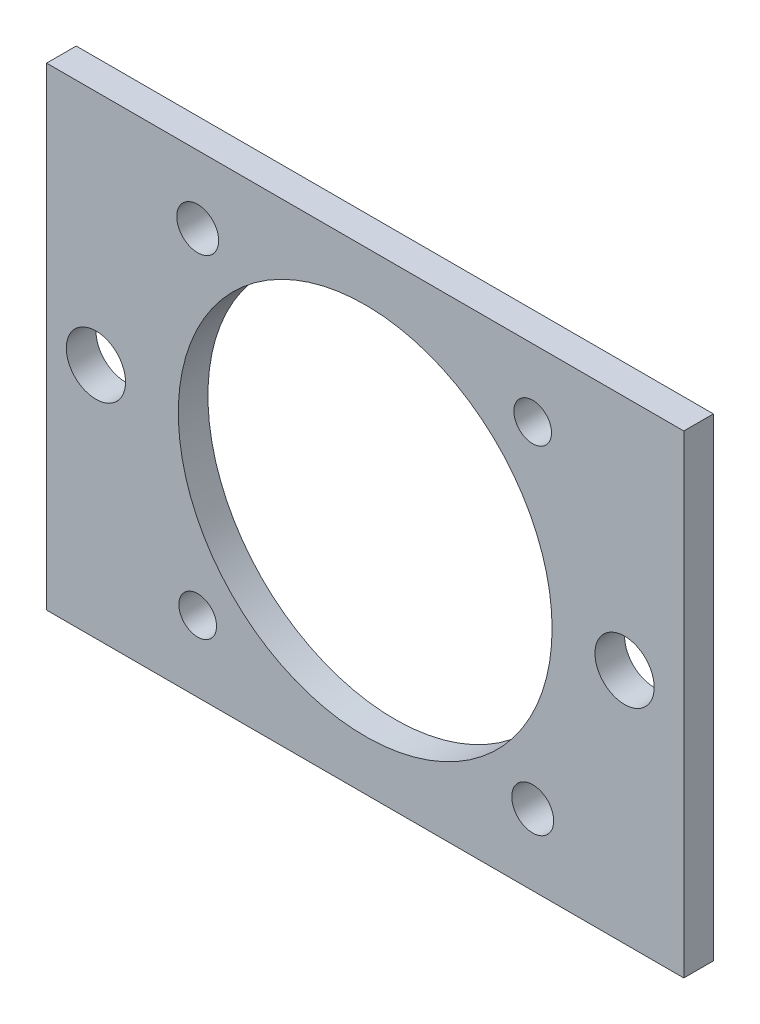
ISO-10303-21;
HEADER;
FILE_DESCRIPTION(('STEP AP214'),'2;1');
FILE_NAME('part.step','',(''),(''),'','','');
FILE_SCHEMA(('AUTOMOTIVE_DESIGN { 1 0 10303 214 1 1 1 1 }'));
ENDSEC;
DATA;
#1=APPLICATION_CONTEXT('core data for automotive mechanical design processes');
#2=APPLICATION_PROTOCOL_DEFINITION('international standard','automotive_design',2000,#1);
#3=PRODUCT_CONTEXT('',#1,'mechanical');
#4=PRODUCT('Part','Part','',(#3));
#5=PRODUCT_RELATED_PRODUCT_CATEGORY('part','',(#4));
#6=PRODUCT_DEFINITION_FORMATION('','',#4);
#7=PRODUCT_DEFINITION_CONTEXT('part definition',#1,'design');
#8=PRODUCT_DEFINITION('design','',#6,#7);
#9=PRODUCT_DEFINITION_SHAPE('','',#8);
#10=(LENGTH_UNIT() NAMED_UNIT(*) SI_UNIT(.MILLI.,.METRE.));
#11=(NAMED_UNIT(*) PLANE_ANGLE_UNIT() SI_UNIT($,.RADIAN.));
#12=(NAMED_UNIT(*) SI_UNIT($,.STERADIAN.) SOLID_ANGLE_UNIT());
#13=UNCERTAINTY_MEASURE_WITH_UNIT(LENGTH_MEASURE(1.E-05),#10,'distance_accuracy_value','');
#14=(GEOMETRIC_REPRESENTATION_CONTEXT(3) GLOBAL_UNCERTAINTY_ASSIGNED_CONTEXT((#13)) GLOBAL_UNIT_ASSIGNED_CONTEXT((#10,
#11,#12)) REPRESENTATION_CONTEXT('',''));
#15=CARTESIAN_POINT('',(0.,0.,0.));
#16=DIRECTION('',(0.,0.,1.));
#17=DIRECTION('',(1.,0.,0.));
#18=AXIS2_PLACEMENT_3D('',#15,#16,#17);
#19=CARTESIAN_POINT('',(0.,0.,3.175));
#20=DIRECTION('',(0.,0.,-1.));
#21=DIRECTION('',(-1.,0.,0.));
#22=AXIS2_PLACEMENT_3D('',#19,#20,#21);
#23=PLANE('',#22);
#24=DIRECTION('',(0.,1.,0.));
#25=VECTOR('',#24,1.);
#26=CARTESIAN_POINT('',(34.163,-25.4,3.175));
#27=LINE('',#26,#25);
#28=CARTESIAN_POINT('',(34.163,-25.4,3.175));
#29=VERTEX_POINT('',#28);
#30=CARTESIAN_POINT('',(34.163,25.4,3.175));
#31=VERTEX_POINT('',#30);
#32=EDGE_CURVE('E85',#29,#31,#27,.T.);
#33=ORIENTED_EDGE('',*,*,#32,.T.);
#34=DIRECTION('',(-1.,0.,0.));
#35=VECTOR('',#34,1.);
#36=CARTESIAN_POINT('',(-34.163,25.4,3.175));
#37=LINE('',#36,#35);
#38=CARTESIAN_POINT('',(-34.163,25.4,3.175));
#39=VERTEX_POINT('',#38);
#40=EDGE_CURVE('E80',#31,#39,#37,.T.);
#41=ORIENTED_EDGE('',*,*,#40,.T.);
#42=DIRECTION('',(0.,-1.,0.));
#43=VECTOR('',#42,1.);
#44=CARTESIAN_POINT('',(-34.163,-25.4,3.175));
#45=LINE('',#44,#43);
#46=CARTESIAN_POINT('',(-34.163,-25.4,3.175));
#47=VERTEX_POINT('',#46);
#48=EDGE_CURVE('E83',#39,#47,#45,.T.);
#49=ORIENTED_EDGE('',*,*,#48,.T.);
#50=DIRECTION('',(1.,0.,0.));
#51=VECTOR('',#50,1.);
#52=CARTESIAN_POINT('',(-34.163,-25.4,3.175));
#53=LINE('',#52,#51);
#54=EDGE_CURVE('E50',#47,#29,#53,.T.);
#55=ORIENTED_EDGE('',*,*,#54,.T.);
#56=EDGE_LOOP('',(#33,#41,#49,#55));
#57=FACE_BOUND('',#56,.T.);
#58=CARTESIAN_POINT('',(-17.9605122421383,18.1332322421383,3.175));
#59=DIRECTION('',(0.,0.,1.));
#60=DIRECTION('',(1.,0.,0.));
#61=AXIS2_PLACEMENT_3D('',#58,#59,#60);
#62=CIRCLE('',#61,2.2479);
#63=CARTESIAN_POINT('',(-15.7126122421383,18.1332322421383,3.175));
#64=VERTEX_POINT('',#63);
#65=EDGE_CURVE('E100',#64,#64,#62,.T.);
#66=ORIENTED_EDGE('',*,*,#65,.F.);
#67=EDGE_LOOP('',(#66));
#68=FACE_BOUND('',#67,.T.);
#69=CARTESIAN_POINT('',(17.9605122421383,18.1332322421383,3.175));
#70=DIRECTION('',(0.,0.,1.));
#71=DIRECTION('',(1.,0.,0.));
#72=AXIS2_PLACEMENT_3D('',#69,#70,#71);
#73=CIRCLE('',#72,2.0193);
#74=CARTESIAN_POINT('',(19.9798122421383,18.1332322421383,3.175));
#75=VERTEX_POINT('',#74);
#76=EDGE_CURVE('E115',#75,#75,#73,.T.);
#77=ORIENTED_EDGE('',*,*,#76,.F.);
#78=EDGE_LOOP('',(#77));
#79=FACE_BOUND('',#78,.T.);
#80=CARTESIAN_POINT('',(17.9605122421383,-17.7877922421383,3.175));
#81=DIRECTION('',(0.,0.,1.));
#82=DIRECTION('',(1.,0.,0.));
#83=AXIS2_PLACEMENT_3D('',#80,#81,#82);
#84=CIRCLE('',#83,2.2479);
#85=CARTESIAN_POINT('',(20.2084122421383,-17.7877922421383,3.175));
#86=VERTEX_POINT('',#85);
#87=EDGE_CURVE('E121',#86,#86,#84,.T.);
#88=ORIENTED_EDGE('',*,*,#87,.F.);
#89=EDGE_LOOP('',(#88));
#90=FACE_BOUND('',#89,.T.);
#91=CARTESIAN_POINT('',(-17.9605122421383,-17.7877922421383,3.175));
#92=DIRECTION('',(0.,0.,1.));
#93=DIRECTION('',(1.,0.,0.));
#94=AXIS2_PLACEMENT_3D('',#91,#92,#93);
#95=CIRCLE('',#94,2.0193);
#96=CARTESIAN_POINT('',(-15.9412122421383,-17.7877922421383,3.175));
#97=VERTEX_POINT('',#96);
#98=EDGE_CURVE('E127',#97,#97,#95,.T.);
#99=ORIENTED_EDGE('',*,*,#98,.F.);
#100=EDGE_LOOP('',(#99));
#101=FACE_BOUND('',#100,.T.);
#102=CARTESIAN_POINT('',(0.,0.,3.175));
#103=DIRECTION('',(0.,0.,1.));
#104=DIRECTION('',(1.,0.,0.));
#105=AXIS2_PLACEMENT_3D('',#102,#103,#104);
#106=CIRCLE('',#105,20.0406);
#107=CARTESIAN_POINT('',(20.0406,0.,3.175));
#108=VERTEX_POINT('',#107);
#109=EDGE_CURVE('E133',#108,#108,#106,.T.);
#110=ORIENTED_EDGE('',*,*,#109,.F.);
#111=EDGE_LOOP('',(#110));
#112=FACE_BOUND('',#111,.T.);
#113=CARTESIAN_POINT('',(-28.8748297994108,0.,3.175));
#114=DIRECTION('',(0.,0.,1.));
#115=DIRECTION('',(1.,0.,0.));
#116=AXIS2_PLACEMENT_3D('',#113,#114,#115);
#117=CIRCLE('',#116,3.175);
#118=CARTESIAN_POINT('',(-25.6998297994108,0.,3.175));
#119=VERTEX_POINT('',#118);
#120=EDGE_CURVE('E139',#119,#119,#117,.T.);
#121=ORIENTED_EDGE('',*,*,#120,.F.);
#122=EDGE_LOOP('',(#121));
#123=FACE_BOUND('',#122,.T.);
#124=CARTESIAN_POINT('',(27.813,0.,3.175));
#125=DIRECTION('',(0.,0.,1.));
#126=DIRECTION('',(1.,0.,0.));
#127=AXIS2_PLACEMENT_3D('',#124,#125,#126);
#128=CIRCLE('',#127,3.175);
#129=CARTESIAN_POINT('',(30.988,0.,3.175));
#130=VERTEX_POINT('',#129);
#131=EDGE_CURVE('E145',#130,#130,#128,.T.);
#132=ORIENTED_EDGE('',*,*,#131,.F.);
#133=EDGE_LOOP('',(#132));
#134=FACE_BOUND('',#133,.T.);
#135=ADVANCED_FACE('F33',(#57,#68,#79,#90,#101,#112,#123,#134),#23,.F.);
#136=CARTESIAN_POINT('',(0.,0.,0.));
#137=DIRECTION('',(0.,0.,-1.));
#138=DIRECTION('',(-1.,0.,0.));
#139=AXIS2_PLACEMENT_3D('',#136,#137,#138);
#140=PLANE('',#139);
#141=CARTESIAN_POINT('',(-28.8748297994108,0.,0.));
#142=DIRECTION('',(0.,0.,1.));
#143=DIRECTION('',(1.,0.,0.));
#144=AXIS2_PLACEMENT_3D('',#141,#142,#143);
#145=CIRCLE('',#144,3.175);
#146=CARTESIAN_POINT('',(-25.6998297994108,0.,0.));
#147=VERTEX_POINT('',#146);
#148=EDGE_CURVE('E142',#147,#147,#145,.T.);
#149=ORIENTED_EDGE('',*,*,#148,.T.);
#150=EDGE_LOOP('',(#149));
#151=FACE_BOUND('',#150,.T.);
#152=CARTESIAN_POINT('',(-17.9605122421383,-17.7877922421383,0.));
#153=DIRECTION('',(0.,0.,1.));
#154=DIRECTION('',(1.,0.,0.));
#155=AXIS2_PLACEMENT_3D('',#152,#153,#154);
#156=CIRCLE('',#155,2.0193);
#157=CARTESIAN_POINT('',(-15.9412122421383,-17.7877922421383,0.));
#158=VERTEX_POINT('',#157);
#159=EDGE_CURVE('E130',#158,#158,#156,.T.);
#160=ORIENTED_EDGE('',*,*,#159,.T.);
#161=EDGE_LOOP('',(#160));
#162=FACE_BOUND('',#161,.T.);
#163=CARTESIAN_POINT('',(17.9605122421383,18.1332322421383,0.));
#164=DIRECTION('',(0.,0.,1.));
#165=DIRECTION('',(1.,0.,0.));
#166=AXIS2_PLACEMENT_3D('',#163,#164,#165);
#167=CIRCLE('',#166,2.0193);
#168=CARTESIAN_POINT('',(19.9798122421383,18.1332322421383,0.));
#169=VERTEX_POINT('',#168);
#170=EDGE_CURVE('E118',#169,#169,#167,.T.);
#171=ORIENTED_EDGE('',*,*,#170,.T.);
#172=EDGE_LOOP('',(#171));
#173=FACE_BOUND('',#172,.T.);
#174=DIRECTION('',(0.,1.,0.));
#175=VECTOR('',#174,1.);
#176=CARTESIAN_POINT('',(34.163,-25.4,0.));
#177=LINE('',#176,#175);
#178=CARTESIAN_POINT('',(34.163,-25.4,0.));
#179=VERTEX_POINT('',#178);
#180=CARTESIAN_POINT('',(34.163,25.4,0.));
#181=VERTEX_POINT('',#180);
#182=EDGE_CURVE('E97',#179,#181,#177,.T.);
#183=ORIENTED_EDGE('',*,*,#182,.F.);
#184=DIRECTION('',(1.,0.,0.));
#185=VECTOR('',#184,1.);
#186=CARTESIAN_POINT('',(-34.163,-25.4,0.));
#187=LINE('',#186,#185);
#188=CARTESIAN_POINT('',(-34.163,-25.4,0.));
#189=VERTEX_POINT('',#188);
#190=EDGE_CURVE('E73',#189,#179,#187,.T.);
#191=ORIENTED_EDGE('',*,*,#190,.F.);
#192=DIRECTION('',(0.,-1.,0.));
#193=VECTOR('',#192,1.);
#194=CARTESIAN_POINT('',(-34.163,-25.4,0.));
#195=LINE('',#194,#193);
#196=CARTESIAN_POINT('',(-34.163,25.4,0.));
#197=VERTEX_POINT('',#196);
#198=EDGE_CURVE('E67',#197,#189,#195,.T.);
#199=ORIENTED_EDGE('',*,*,#198,.F.);
#200=DIRECTION('',(-1.,0.,0.));
#201=VECTOR('',#200,1.);
#202=CARTESIAN_POINT('',(-34.163,25.4,0.));
#203=LINE('',#202,#201);
#204=EDGE_CURVE('E89',#181,#197,#203,.T.);
#205=ORIENTED_EDGE('',*,*,#204,.F.);
#206=EDGE_LOOP('',(#183,#191,#199,#205));
#207=FACE_BOUND('',#206,.T.);
#208=CARTESIAN_POINT('',(-17.9605122421383,18.1332322421383,0.));
#209=DIRECTION('',(0.,0.,1.));
#210=DIRECTION('',(1.,0.,0.));
#211=AXIS2_PLACEMENT_3D('',#208,#209,#210);
#212=CIRCLE('',#211,2.2479);
#213=CARTESIAN_POINT('',(-15.7126122421383,18.1332322421383,0.));
#214=VERTEX_POINT('',#213);
#215=EDGE_CURVE('E112',#214,#214,#212,.T.);
#216=ORIENTED_EDGE('',*,*,#215,.T.);
#217=EDGE_LOOP('',(#216));
#218=FACE_BOUND('',#217,.T.);
#219=CARTESIAN_POINT('',(17.9605122421383,-17.7877922421383,0.));
#220=DIRECTION('',(0.,0.,1.));
#221=DIRECTION('',(1.,0.,0.));
#222=AXIS2_PLACEMENT_3D('',#219,#220,#221);
#223=CIRCLE('',#222,2.2479);
#224=CARTESIAN_POINT('',(20.2084122421383,-17.7877922421383,0.));
#225=VERTEX_POINT('',#224);
#226=EDGE_CURVE('E124',#225,#225,#223,.T.);
#227=ORIENTED_EDGE('',*,*,#226,.T.);
#228=EDGE_LOOP('',(#227));
#229=FACE_BOUND('',#228,.T.);
#230=CARTESIAN_POINT('',(0.,0.,0.));
#231=DIRECTION('',(0.,0.,1.));
#232=DIRECTION('',(1.,0.,0.));
#233=AXIS2_PLACEMENT_3D('',#230,#231,#232);
#234=CIRCLE('',#233,20.0406);
#235=CARTESIAN_POINT('',(20.0406,0.,0.));
#236=VERTEX_POINT('',#235);
#237=EDGE_CURVE('E136',#236,#236,#234,.T.);
#238=ORIENTED_EDGE('',*,*,#237,.T.);
#239=EDGE_LOOP('',(#238));
#240=FACE_BOUND('',#239,.T.);
#241=CARTESIAN_POINT('',(27.813,0.,0.));
#242=DIRECTION('',(0.,0.,1.));
#243=DIRECTION('',(1.,0.,0.));
#244=AXIS2_PLACEMENT_3D('',#241,#242,#243);
#245=CIRCLE('',#244,3.175);
#246=CARTESIAN_POINT('',(30.988,0.,0.));
#247=VERTEX_POINT('',#246);
#248=EDGE_CURVE('E148',#247,#247,#245,.T.);
#249=ORIENTED_EDGE('',*,*,#248,.T.);
#250=EDGE_LOOP('',(#249));
#251=FACE_BOUND('',#250,.T.);
#252=ADVANCED_FACE('F108',(#151,#162,#173,#207,#218,#229,#240,#251),#140,.T.);
#253=CARTESIAN_POINT('',(34.163,-25.4,3.175));
#254=DIRECTION('',(-1.,0.,0.));
#255=DIRECTION('',(0.,0.,1.));
#256=AXIS2_PLACEMENT_3D('',#253,#254,#255);
#257=PLANE('',#256);
#258=ORIENTED_EDGE('',*,*,#182,.T.);
#259=DIRECTION('',(0.,0.,-1.));
#260=VECTOR('',#259,1.);
#261=CARTESIAN_POINT('',(34.163,25.4,3.175));
#262=LINE('',#261,#260);
#263=EDGE_CURVE('E11',#31,#181,#262,.T.);
#264=ORIENTED_EDGE('',*,*,#263,.F.);
#265=ORIENTED_EDGE('',*,*,#32,.F.);
#266=DIRECTION('',(0.,0.,-1.));
#267=VECTOR('',#266,1.);
#268=CARTESIAN_POINT('',(34.163,-25.4,3.175));
#269=LINE('',#268,#267);
#270=EDGE_CURVE('E93',#29,#179,#269,.T.);
#271=ORIENTED_EDGE('',*,*,#270,.T.);
#272=EDGE_LOOP('',(#258,#264,#265,#271));
#273=FACE_BOUND('',#272,.T.);
#274=ADVANCED_FACE('F35',(#273),#257,.F.);
#275=CARTESIAN_POINT('',(-34.163,25.4,3.175));
#276=DIRECTION('',(0.,-1.,0.));
#277=DIRECTION('',(0.,0.,-1.));
#278=AXIS2_PLACEMENT_3D('',#275,#276,#277);
#279=PLANE('',#278);
#280=ORIENTED_EDGE('',*,*,#204,.T.);
#281=DIRECTION('',(0.,0.,-1.));
#282=VECTOR('',#281,1.);
#283=CARTESIAN_POINT('',(-34.163,25.4,3.175));
#284=LINE('',#283,#282);
#285=EDGE_CURVE('E42',#39,#197,#284,.T.);
#286=ORIENTED_EDGE('',*,*,#285,.F.);
#287=ORIENTED_EDGE('',*,*,#40,.F.);
#288=ORIENTED_EDGE('',*,*,#263,.T.);
#289=EDGE_LOOP('',(#280,#286,#287,#288));
#290=FACE_BOUND('',#289,.T.);
#291=ADVANCED_FACE('F88',(#290),#279,.F.);
#292=CARTESIAN_POINT('',(-34.163,-25.4,3.175));
#293=DIRECTION('',(1.,0.,0.));
#294=DIRECTION('',(0.,0.,-1.));
#295=AXIS2_PLACEMENT_3D('',#292,#293,#294);
#296=PLANE('',#295);
#297=ORIENTED_EDGE('',*,*,#198,.T.);
#298=DIRECTION('',(0.,0.,-1.));
#299=VECTOR('',#298,1.);
#300=CARTESIAN_POINT('',(-34.163,-25.4,3.175));
#301=LINE('',#300,#299);
#302=EDGE_CURVE('E90',#47,#189,#301,.T.);
#303=ORIENTED_EDGE('',*,*,#302,.F.);
#304=ORIENTED_EDGE('',*,*,#48,.F.);
#305=ORIENTED_EDGE('',*,*,#285,.T.);
#306=EDGE_LOOP('',(#297,#303,#304,#305));
#307=FACE_BOUND('',#306,.T.);
#308=ADVANCED_FACE('F91',(#307),#296,.F.);
#309=CARTESIAN_POINT('',(-34.163,-25.4,3.175));
#310=DIRECTION('',(0.,1.,0.));
#311=DIRECTION('',(-1.,0.,0.));
#312=AXIS2_PLACEMENT_3D('',#309,#310,#311);
#313=PLANE('',#312);
#314=ORIENTED_EDGE('',*,*,#190,.T.);
#315=ORIENTED_EDGE('',*,*,#270,.F.);
#316=ORIENTED_EDGE('',*,*,#54,.F.);
#317=ORIENTED_EDGE('',*,*,#302,.T.);
#318=EDGE_LOOP('',(#314,#315,#316,#317));
#319=FACE_BOUND('',#318,.T.);
#320=ADVANCED_FACE('F105',(#319),#313,.F.);
#321=CARTESIAN_POINT('',(-17.9605122421383,18.1332322421383,3.175));
#322=DIRECTION('',(0.,0.,-1.));
#323=DIRECTION('',(-1.,0.,0.));
#324=AXIS2_PLACEMENT_3D('',#321,#322,#323);
#325=CYLINDRICAL_SURFACE('',#324,2.2479);
#326=ORIENTED_EDGE('',*,*,#65,.T.);
#327=EDGE_LOOP('',(#326));
#328=FACE_BOUND('',#327,.T.);
#329=ORIENTED_EDGE('',*,*,#215,.F.);
#330=EDGE_LOOP('',(#329));
#331=FACE_BOUND('',#330,.T.);
#332=ADVANCED_FACE('F165',(#328,#331),#325,.F.);
#333=CARTESIAN_POINT('',(17.9605122421383,18.1332322421383,3.175));
#334=DIRECTION('',(0.,0.,-1.));
#335=DIRECTION('',(-1.,0.,0.));
#336=AXIS2_PLACEMENT_3D('',#333,#334,#335);
#337=CYLINDRICAL_SURFACE('',#336,2.0193);
#338=ORIENTED_EDGE('',*,*,#76,.T.);
#339=EDGE_LOOP('',(#338));
#340=FACE_BOUND('',#339,.T.);
#341=ORIENTED_EDGE('',*,*,#170,.F.);
#342=EDGE_LOOP('',(#341));
#343=FACE_BOUND('',#342,.T.);
#344=ADVANCED_FACE('F211',(#340,#343),#337,.F.);
#345=CARTESIAN_POINT('',(17.9605122421383,-17.7877922421383,3.175));
#346=DIRECTION('',(0.,0.,-1.));
#347=DIRECTION('',(-1.,0.,0.));
#348=AXIS2_PLACEMENT_3D('',#345,#346,#347);
#349=CYLINDRICAL_SURFACE('',#348,2.2479);
#350=ORIENTED_EDGE('',*,*,#87,.T.);
#351=EDGE_LOOP('',(#350));
#352=FACE_BOUND('',#351,.T.);
#353=ORIENTED_EDGE('',*,*,#226,.F.);
#354=EDGE_LOOP('',(#353));
#355=FACE_BOUND('',#354,.T.);
#356=ADVANCED_FACE('F219',(#352,#355),#349,.F.);
#357=CARTESIAN_POINT('',(-17.9605122421383,-17.7877922421383,3.175));
#358=DIRECTION('',(0.,0.,-1.));
#359=DIRECTION('',(-1.,0.,0.));
#360=AXIS2_PLACEMENT_3D('',#357,#358,#359);
#361=CYLINDRICAL_SURFACE('',#360,2.0193);
#362=ORIENTED_EDGE('',*,*,#98,.T.);
#363=EDGE_LOOP('',(#362));
#364=FACE_BOUND('',#363,.T.);
#365=ORIENTED_EDGE('',*,*,#159,.F.);
#366=EDGE_LOOP('',(#365));
#367=FACE_BOUND('',#366,.T.);
#368=ADVANCED_FACE('F227',(#364,#367),#361,.F.);
#369=CARTESIAN_POINT('',(0.,0.,3.175));
#370=DIRECTION('',(0.,0.,-1.));
#371=DIRECTION('',(-1.,0.,0.));
#372=AXIS2_PLACEMENT_3D('',#369,#370,#371);
#373=CYLINDRICAL_SURFACE('',#372,20.0406);
#374=ORIENTED_EDGE('',*,*,#109,.T.);
#375=EDGE_LOOP('',(#374));
#376=FACE_BOUND('',#375,.T.);
#377=ORIENTED_EDGE('',*,*,#237,.F.);
#378=EDGE_LOOP('',(#377));
#379=FACE_BOUND('',#378,.T.);
#380=ADVANCED_FACE('F236',(#376,#379),#373,.F.);
#381=CARTESIAN_POINT('',(-28.8748297994108,0.,3.175));
#382=DIRECTION('',(0.,0.,-1.));
#383=DIRECTION('',(-1.,0.,0.));
#384=AXIS2_PLACEMENT_3D('',#381,#382,#383);
#385=CYLINDRICAL_SURFACE('',#384,3.175);
#386=ORIENTED_EDGE('',*,*,#120,.T.);
#387=EDGE_LOOP('',(#386));
#388=FACE_BOUND('',#387,.T.);
#389=ORIENTED_EDGE('',*,*,#148,.F.);
#390=EDGE_LOOP('',(#389));
#391=FACE_BOUND('',#390,.T.);
#392=ADVANCED_FACE('F245',(#388,#391),#385,.F.);
#393=CARTESIAN_POINT('',(27.813,0.,3.175));
#394=DIRECTION('',(0.,0.,-1.));
#395=DIRECTION('',(-1.,0.,0.));
#396=AXIS2_PLACEMENT_3D('',#393,#394,#395);
#397=CYLINDRICAL_SURFACE('',#396,3.175);
#398=ORIENTED_EDGE('',*,*,#131,.T.);
#399=EDGE_LOOP('',(#398));
#400=FACE_BOUND('',#399,.T.);
#401=ORIENTED_EDGE('',*,*,#248,.F.);
#402=EDGE_LOOP('',(#401));
#403=FACE_BOUND('',#402,.T.);
#404=ADVANCED_FACE('F154',(#400,#403),#397,.F.);
#405=CLOSED_SHELL('',(#135,#252,#274,#291,#308,#320,#332,#344,#356,#368,#380,#392,#404));
#406=MANIFOLD_SOLID_BREP('B2',#405);
#407=ADVANCED_BREP_SHAPE_REPRESENTATION('',(#18,#406),#14);
#408=SHAPE_DEFINITION_REPRESENTATION(#9,#407);
ENDSEC;
END-ISO-10303-21;
